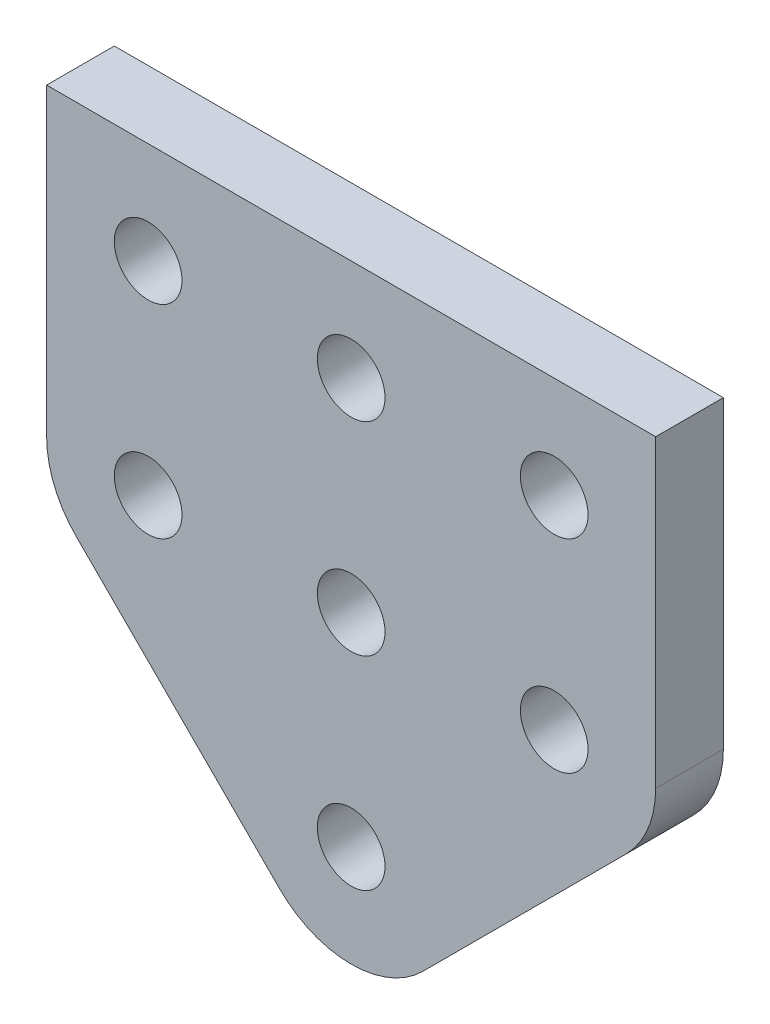
ISO-10303-21;
HEADER;
FILE_DESCRIPTION(('STEP AP214'),'2;1');
FILE_NAME('part.step','',(''),(''),'','','');
FILE_SCHEMA(('AUTOMOTIVE_DESIGN { 1 0 10303 214 1 1 1 1 }'));
ENDSEC;
DATA;
#1=APPLICATION_CONTEXT('core data for automotive mechanical design processes');
#2=APPLICATION_PROTOCOL_DEFINITION('international standard','automotive_design',2000,#1);
#3=PRODUCT_CONTEXT('',#1,'mechanical');
#4=PRODUCT('Part','Part','',(#3));
#5=PRODUCT_RELATED_PRODUCT_CATEGORY('part','',(#4));
#6=PRODUCT_DEFINITION_FORMATION('','',#4);
#7=PRODUCT_DEFINITION_CONTEXT('part definition',#1,'design');
#8=PRODUCT_DEFINITION('design','',#6,#7);
#9=PRODUCT_DEFINITION_SHAPE('','',#8);
#10=(LENGTH_UNIT() NAMED_UNIT(*) SI_UNIT(.MILLI.,.METRE.));
#11=(NAMED_UNIT(*) PLANE_ANGLE_UNIT() SI_UNIT($,.RADIAN.));
#12=(NAMED_UNIT(*) SI_UNIT($,.STERADIAN.) SOLID_ANGLE_UNIT());
#13=UNCERTAINTY_MEASURE_WITH_UNIT(LENGTH_MEASURE(1.E-05),#10,'distance_accuracy_value','');
#14=(GEOMETRIC_REPRESENTATION_CONTEXT(3) GLOBAL_UNCERTAINTY_ASSIGNED_CONTEXT((#13)) GLOBAL_UNIT_ASSIGNED_CONTEXT((#10,
#11,#12)) REPRESENTATION_CONTEXT('',''));
#15=CARTESIAN_POINT('',(0.,0.,0.));
#16=DIRECTION('',(0.,0.,1.));
#17=DIRECTION('',(1.,0.,0.));
#18=AXIS2_PLACEMENT_3D('',#15,#16,#17);
#19=CARTESIAN_POINT('',(187.7270545748,195.1787200631,3.));
#20=DIRECTION('',(0.,0.,1.));
#21=DIRECTION('',(1.,0.,0.));
#22=AXIS2_PLACEMENT_3D('',#19,#20,#21);
#23=PLANE('',#22);
#24=CARTESIAN_POINT('',(187.7270545748,195.1787200631,3.));
#25=DIRECTION('',(0.,0.,1.));
#26=DIRECTION('',(1.,0.,0.));
#27=AXIS2_PLACEMENT_3D('',#24,#25,#26);
#28=CIRCLE('',#27,1.5);
#29=CARTESIAN_POINT('',(189.2270545748,195.1787200631,3.));
#30=VERTEX_POINT('',#29);
#31=EDGE_CURVE('E206',#30,#30,#28,.T.);
#32=ORIENTED_EDGE('',*,*,#31,.F.);
#33=EDGE_LOOP('',(#32));
#34=FACE_BOUND('',#33,.T.);
#35=CARTESIAN_POINT('',(178.7270545748,213.1787200631,3.));
#36=DIRECTION('',(0.,0.,1.));
#37=DIRECTION('',(1.,0.,0.));
#38=AXIS2_PLACEMENT_3D('',#35,#36,#37);
#39=CIRCLE('',#38,1.5);
#40=CARTESIAN_POINT('',(180.2270545748,213.1787200631,3.));
#41=VERTEX_POINT('',#40);
#42=EDGE_CURVE('E194',#41,#41,#39,.T.);
#43=ORIENTED_EDGE('',*,*,#42,.F.);
#44=EDGE_LOOP('',(#43));
#45=FACE_BOUND('',#44,.T.);
#46=CARTESIAN_POINT('',(178.7270545748,204.1787200631,3.));
#47=DIRECTION('',(0.,0.,1.));
#48=DIRECTION('',(1.,0.,0.));
#49=AXIS2_PLACEMENT_3D('',#46,#47,#48);
#50=CIRCLE('',#49,1.5);
#51=CARTESIAN_POINT('',(180.2270545748,204.1787200631,3.));
#52=VERTEX_POINT('',#51);
#53=EDGE_CURVE('E182',#52,#52,#50,.T.);
#54=ORIENTED_EDGE('',*,*,#53,.F.);
#55=EDGE_LOOP('',(#54));
#56=FACE_BOUND('',#55,.T.);
#57=CARTESIAN_POINT('',(187.7270545748,195.1787200631,3.));
#58=DIRECTION('',(0.,0.,1.));
#59=DIRECTION('',(1.,0.,0.));
#60=AXIS2_PLACEMENT_3D('',#57,#58,#59);
#61=CIRCLE('',#60,4.50000000005025);
#62=CARTESIAN_POINT('',(184.5450740594,191.9967395477,3.));
#63=VERTEX_POINT('',#62);
#64=CARTESIAN_POINT('',(190.9090350901,191.9967395477,3.));
#65=VERTEX_POINT('',#64);
#66=EDGE_CURVE('E145',#63,#65,#61,.T.);
#67=ORIENTED_EDGE('',*,*,#66,.T.);
#68=DIRECTION('',(0.707106781186548,0.707106781186548,0.));
#69=VECTOR('',#68,1.);
#70=CARTESIAN_POINT('',(190.9090350901,191.9967395477,3.));
#71=LINE('',#70,#69);
#72=CARTESIAN_POINT('',(199.909035090095,200.996739547705,3.));
#73=VERTEX_POINT('',#72);
#74=EDGE_CURVE('E93',#65,#73,#71,.T.);
#75=ORIENTED_EDGE('',*,*,#74,.T.);
#76=CARTESIAN_POINT('',(196.7270545748,204.1787200631,3.));
#77=DIRECTION('',(0.,0.,1.));
#78=DIRECTION('',(1.,0.,0.));
#79=AXIS2_PLACEMENT_3D('',#76,#77,#78);
#80=CIRCLE('',#79,4.50000000000745);
#81=CARTESIAN_POINT('',(201.2270545748,204.1787200631,3.));
#82=VERTEX_POINT('',#81);
#83=EDGE_CURVE('E160',#73,#82,#80,.T.);
#84=ORIENTED_EDGE('',*,*,#83,.T.);
#85=DIRECTION('',(0.,1.,0.));
#86=VECTOR('',#85,1.);
#87=CARTESIAN_POINT('',(201.2270545748,217.6787200631,3.));
#88=LINE('',#87,#86);
#89=CARTESIAN_POINT('',(201.2270545748,217.6787200631,3.));
#90=VERTEX_POINT('',#89);
#91=EDGE_CURVE('E173',#82,#90,#88,.T.);
#92=ORIENTED_EDGE('',*,*,#91,.T.);
#93=DIRECTION('',(-1.,0.,0.));
#94=VECTOR('',#93,1.);
#95=CARTESIAN_POINT('',(201.2270545748,217.6787200631,3.));
#96=LINE('',#95,#94);
#97=CARTESIAN_POINT('',(174.2270545748,217.6787200631,3.));
#98=VERTEX_POINT('',#97);
#99=EDGE_CURVE('E112',#90,#98,#96,.T.);
#100=ORIENTED_EDGE('',*,*,#99,.T.);
#101=DIRECTION('',(0.,-1.,0.));
#102=VECTOR('',#101,1.);
#103=CARTESIAN_POINT('',(174.2270545748,213.1787200631,3.));
#104=LINE('',#103,#102);
#105=CARTESIAN_POINT('',(174.227054574757,204.1787200631,3.));
#106=VERTEX_POINT('',#105);
#107=EDGE_CURVE('E106',#98,#106,#104,.T.);
#108=ORIENTED_EDGE('',*,*,#107,.T.);
#109=CARTESIAN_POINT('',(178.7270545748,204.1787200631,3.));
#110=DIRECTION('',(0.,0.,1.));
#111=DIRECTION('',(1.,0.,0.));
#112=AXIS2_PLACEMENT_3D('',#109,#110,#111);
#113=CIRCLE('',#112,4.50000000004281);
#114=CARTESIAN_POINT('',(175.5450740594,200.9967395477,3.));
#115=VERTEX_POINT('',#114);
#116=EDGE_CURVE('E110',#106,#115,#113,.T.);
#117=ORIENTED_EDGE('',*,*,#116,.T.);
#118=DIRECTION('',(0.707106781186548,-0.707106781186548,0.));
#119=VECTOR('',#118,1.);
#120=CARTESIAN_POINT('',(184.5450740594,191.9967395477,3.));
#121=LINE('',#120,#119);
#122=EDGE_CURVE('E50',#115,#63,#121,.T.);
#123=ORIENTED_EDGE('',*,*,#122,.T.);
#124=EDGE_LOOP('',(#67,#75,#84,#92,#100,#108,#117,#123));
#125=FACE_BOUND('',#124,.T.);
#126=CARTESIAN_POINT('',(187.7270545748,204.1787200631,3.));
#127=DIRECTION('',(0.,0.,1.));
#128=DIRECTION('',(1.,0.,0.));
#129=AXIS2_PLACEMENT_3D('',#126,#127,#128);
#130=CIRCLE('',#129,1.5);
#131=CARTESIAN_POINT('',(189.2270545748,204.1787200631,3.));
#132=VERTEX_POINT('',#131);
#133=EDGE_CURVE('E133',#132,#132,#130,.T.);
#134=ORIENTED_EDGE('',*,*,#133,.F.);
#135=EDGE_LOOP('',(#134));
#136=FACE_BOUND('',#135,.T.);
#137=CARTESIAN_POINT('',(187.7270545748,213.1787200631,3.));
#138=DIRECTION('',(0.,0.,1.));
#139=DIRECTION('',(1.,0.,0.));
#140=AXIS2_PLACEMENT_3D('',#137,#138,#139);
#141=CIRCLE('',#140,1.5);
#142=CARTESIAN_POINT('',(189.2270545748,213.1787200631,3.));
#143=VERTEX_POINT('',#142);
#144=EDGE_CURVE('E188',#143,#143,#141,.T.);
#145=ORIENTED_EDGE('',*,*,#144,.F.);
#146=EDGE_LOOP('',(#145));
#147=FACE_BOUND('',#146,.T.);
#148=CARTESIAN_POINT('',(196.7270545748,213.1787200631,3.));
#149=DIRECTION('',(0.,0.,1.));
#150=DIRECTION('',(1.,0.,0.));
#151=AXIS2_PLACEMENT_3D('',#148,#149,#150);
#152=CIRCLE('',#151,1.5);
#153=CARTESIAN_POINT('',(198.2270545748,213.1787200631,3.));
#154=VERTEX_POINT('',#153);
#155=EDGE_CURVE('E200',#154,#154,#152,.T.);
#156=ORIENTED_EDGE('',*,*,#155,.F.);
#157=EDGE_LOOP('',(#156));
#158=FACE_BOUND('',#157,.T.);
#159=CARTESIAN_POINT('',(196.7270545748,204.1787200631,3.));
#160=DIRECTION('',(0.,0.,1.));
#161=DIRECTION('',(1.,0.,0.));
#162=AXIS2_PLACEMENT_3D('',#159,#160,#161);
#163=CIRCLE('',#162,1.5);
#164=CARTESIAN_POINT('',(198.2270545748,204.1787200631,3.));
#165=VERTEX_POINT('',#164);
#166=EDGE_CURVE('E212',#165,#165,#163,.T.);
#167=ORIENTED_EDGE('',*,*,#166,.F.);
#168=EDGE_LOOP('',(#167));
#169=FACE_BOUND('',#168,.T.);
#170=ADVANCED_FACE('F33',(#34,#45,#56,#125,#136,#147,#158,#169),#23,.T.);
#171=CARTESIAN_POINT('',(187.7270545748,195.1787200631,0.));
#172=DIRECTION('',(0.,0.,1.));
#173=DIRECTION('',(1.,0.,0.));
#174=AXIS2_PLACEMENT_3D('',#171,#172,#173);
#175=PLANE('',#174);
#176=CARTESIAN_POINT('',(187.7270545748,195.1787200631,0.));
#177=DIRECTION('',(0.,0.,1.));
#178=DIRECTION('',(1.,0.,0.));
#179=AXIS2_PLACEMENT_3D('',#176,#177,#178);
#180=CIRCLE('',#179,1.5);
#181=CARTESIAN_POINT('',(189.2270545748,195.1787200631,0.));
#182=VERTEX_POINT('',#181);
#183=EDGE_CURVE('E209',#182,#182,#180,.T.);
#184=ORIENTED_EDGE('',*,*,#183,.T.);
#185=EDGE_LOOP('',(#184));
#186=FACE_BOUND('',#185,.T.);
#187=CARTESIAN_POINT('',(178.7270545748,213.1787200631,0.));
#188=DIRECTION('',(0.,0.,1.));
#189=DIRECTION('',(1.,0.,0.));
#190=AXIS2_PLACEMENT_3D('',#187,#188,#189);
#191=CIRCLE('',#190,1.5);
#192=CARTESIAN_POINT('',(180.2270545748,213.1787200631,0.));
#193=VERTEX_POINT('',#192);
#194=EDGE_CURVE('E197',#193,#193,#191,.T.);
#195=ORIENTED_EDGE('',*,*,#194,.T.);
#196=EDGE_LOOP('',(#195));
#197=FACE_BOUND('',#196,.T.);
#198=CARTESIAN_POINT('',(178.7270545748,204.1787200631,0.));
#199=DIRECTION('',(0.,0.,1.));
#200=DIRECTION('',(1.,0.,0.));
#201=AXIS2_PLACEMENT_3D('',#198,#199,#200);
#202=CIRCLE('',#201,1.5);
#203=CARTESIAN_POINT('',(180.2270545748,204.1787200631,0.));
#204=VERTEX_POINT('',#203);
#205=EDGE_CURVE('E185',#204,#204,#202,.T.);
#206=ORIENTED_EDGE('',*,*,#205,.T.);
#207=EDGE_LOOP('',(#206));
#208=FACE_BOUND('',#207,.T.);
#209=CARTESIAN_POINT('',(187.7270545748,195.1787200631,0.));
#210=DIRECTION('',(0.,0.,1.));
#211=DIRECTION('',(1.,0.,0.));
#212=AXIS2_PLACEMENT_3D('',#209,#210,#211);
#213=CIRCLE('',#212,4.50000000005025);
#214=CARTESIAN_POINT('',(184.5450740594,191.9967395477,0.));
#215=VERTEX_POINT('',#214);
#216=CARTESIAN_POINT('',(190.9090350901,191.9967395477,0.));
#217=VERTEX_POINT('',#216);
#218=EDGE_CURVE('E129',#215,#217,#213,.T.);
#219=ORIENTED_EDGE('',*,*,#218,.F.);
#220=DIRECTION('',(0.707106781186548,-0.707106781186548,0.));
#221=VECTOR('',#220,1.);
#222=CARTESIAN_POINT('',(184.5450740594,191.9967395477,0.));
#223=LINE('',#222,#221);
#224=CARTESIAN_POINT('',(175.5450740594,200.9967395477,0.));
#225=VERTEX_POINT('',#224);
#226=EDGE_CURVE('E85',#225,#215,#223,.T.);
#227=ORIENTED_EDGE('',*,*,#226,.F.);
#228=CARTESIAN_POINT('',(178.7270545748,204.1787200631,0.));
#229=DIRECTION('',(0.,0.,1.));
#230=DIRECTION('',(1.,0.,0.));
#231=AXIS2_PLACEMENT_3D('',#228,#229,#230);
#232=CIRCLE('',#231,4.50000000004281);
#233=CARTESIAN_POINT('',(174.227054574757,204.1787200631,0.));
#234=VERTEX_POINT('',#233);
#235=EDGE_CURVE('E79',#234,#225,#232,.T.);
#236=ORIENTED_EDGE('',*,*,#235,.F.);
#237=DIRECTION('',(0.,-1.,0.));
#238=VECTOR('',#237,1.);
#239=CARTESIAN_POINT('',(174.2270545748,213.1787200631,0.));
#240=LINE('',#239,#238);
#241=CARTESIAN_POINT('',(174.2270545748,217.6787200631,0.));
#242=VERTEX_POINT('',#241);
#243=EDGE_CURVE('E119',#242,#234,#240,.T.);
#244=ORIENTED_EDGE('',*,*,#243,.F.);
#245=DIRECTION('',(-1.,0.,0.));
#246=VECTOR('',#245,1.);
#247=CARTESIAN_POINT('',(201.2270545748,217.6787200631,0.));
#248=LINE('',#247,#246);
#249=CARTESIAN_POINT('',(201.2270545748,217.6787200631,0.));
#250=VERTEX_POINT('',#249);
#251=EDGE_CURVE('E139',#250,#242,#248,.T.);
#252=ORIENTED_EDGE('',*,*,#251,.F.);
#253=DIRECTION('',(0.,1.,0.));
#254=VECTOR('',#253,1.);
#255=CARTESIAN_POINT('',(201.2270545748,217.6787200631,0.));
#256=LINE('',#255,#254);
#257=CARTESIAN_POINT('',(201.2270545748,204.1787200631,0.));
#258=VERTEX_POINT('',#257);
#259=EDGE_CURVE('E137',#258,#250,#256,.T.);
#260=ORIENTED_EDGE('',*,*,#259,.F.);
#261=CARTESIAN_POINT('',(196.7270545748,204.1787200631,0.));
#262=DIRECTION('',(0.,0.,1.));
#263=DIRECTION('',(1.,0.,0.));
#264=AXIS2_PLACEMENT_3D('',#261,#262,#263);
#265=CIRCLE('',#264,4.50000000000745);
#266=CARTESIAN_POINT('',(199.909035090095,200.996739547705,0.));
#267=VERTEX_POINT('',#266);
#268=EDGE_CURVE('E135',#267,#258,#265,.T.);
#269=ORIENTED_EDGE('',*,*,#268,.F.);
#270=DIRECTION('',(0.707106781186548,0.707106781186548,0.));
#271=VECTOR('',#270,1.);
#272=CARTESIAN_POINT('',(190.9090350901,191.9967395477,0.));
#273=LINE('',#272,#271);
#274=EDGE_CURVE('E132',#217,#267,#273,.T.);
#275=ORIENTED_EDGE('',*,*,#274,.F.);
#276=EDGE_LOOP('',(#219,#227,#236,#244,#252,#260,#269,#275));
#277=FACE_BOUND('',#276,.T.);
#278=CARTESIAN_POINT('',(187.7270545748,204.1787200631,0.));
#279=DIRECTION('',(0.,0.,1.));
#280=DIRECTION('',(1.,0.,0.));
#281=AXIS2_PLACEMENT_3D('',#278,#279,#280);
#282=CIRCLE('',#281,1.5);
#283=CARTESIAN_POINT('',(189.2270545748,204.1787200631,0.));
#284=VERTEX_POINT('',#283);
#285=EDGE_CURVE('E179',#284,#284,#282,.T.);
#286=ORIENTED_EDGE('',*,*,#285,.T.);
#287=EDGE_LOOP('',(#286));
#288=FACE_BOUND('',#287,.T.);
#289=CARTESIAN_POINT('',(187.7270545748,213.1787200631,0.));
#290=DIRECTION('',(0.,0.,1.));
#291=DIRECTION('',(1.,0.,0.));
#292=AXIS2_PLACEMENT_3D('',#289,#290,#291);
#293=CIRCLE('',#292,1.5);
#294=CARTESIAN_POINT('',(189.2270545748,213.1787200631,0.));
#295=VERTEX_POINT('',#294);
#296=EDGE_CURVE('E191',#295,#295,#293,.T.);
#297=ORIENTED_EDGE('',*,*,#296,.T.);
#298=EDGE_LOOP('',(#297));
#299=FACE_BOUND('',#298,.T.);
#300=CARTESIAN_POINT('',(196.7270545748,213.1787200631,0.));
#301=DIRECTION('',(0.,0.,1.));
#302=DIRECTION('',(1.,0.,0.));
#303=AXIS2_PLACEMENT_3D('',#300,#301,#302);
#304=CIRCLE('',#303,1.5);
#305=CARTESIAN_POINT('',(198.2270545748,213.1787200631,0.));
#306=VERTEX_POINT('',#305);
#307=EDGE_CURVE('E203',#306,#306,#304,.T.);
#308=ORIENTED_EDGE('',*,*,#307,.T.);
#309=EDGE_LOOP('',(#308));
#310=FACE_BOUND('',#309,.T.);
#311=CARTESIAN_POINT('',(196.7270545748,204.1787200631,0.));
#312=DIRECTION('',(0.,0.,1.));
#313=DIRECTION('',(1.,0.,0.));
#314=AXIS2_PLACEMENT_3D('',#311,#312,#313);
#315=CIRCLE('',#314,1.5);
#316=CARTESIAN_POINT('',(198.2270545748,204.1787200631,0.));
#317=VERTEX_POINT('',#316);
#318=EDGE_CURVE('E215',#317,#317,#315,.T.);
#319=ORIENTED_EDGE('',*,*,#318,.T.);
#320=EDGE_LOOP('',(#319));
#321=FACE_BOUND('',#320,.T.);
#322=ADVANCED_FACE('F164',(#186,#197,#208,#277,#288,#299,#310,#321),#175,.F.);
#323=CARTESIAN_POINT('',(187.7270545748,195.1787200631,3.));
#324=DIRECTION('',(0.,0.,-1.));
#325=DIRECTION('',(-1.,0.,0.));
#326=AXIS2_PLACEMENT_3D('',#323,#324,#325);
#327=CYLINDRICAL_SURFACE('',#326,4.50000000005025);
#328=ORIENTED_EDGE('',*,*,#218,.T.);
#329=DIRECTION('',(0.,0.,-1.));
#330=VECTOR('',#329,1.);
#331=CARTESIAN_POINT('',(190.9090350901,191.9967395477,3.));
#332=LINE('',#331,#330);
#333=EDGE_CURVE('E11',#65,#217,#332,.T.);
#334=ORIENTED_EDGE('',*,*,#333,.F.);
#335=ORIENTED_EDGE('',*,*,#66,.F.);
#336=DIRECTION('',(0.,0.,-1.));
#337=VECTOR('',#336,1.);
#338=CARTESIAN_POINT('',(184.5450740594,191.9967395477,3.));
#339=LINE('',#338,#337);
#340=EDGE_CURVE('E125',#63,#215,#339,.T.);
#341=ORIENTED_EDGE('',*,*,#340,.T.);
#342=EDGE_LOOP('',(#328,#334,#335,#341));
#343=FACE_BOUND('',#342,.T.);
#344=ADVANCED_FACE('F35',(#343),#327,.T.);
#345=CARTESIAN_POINT('',(190.9090350901,191.9967395477,3.));
#346=DIRECTION('',(-0.707106781186547,0.707106781186547,0.));
#347=DIRECTION('',(-0.707106781186548,-0.707106781186548,0.));
#348=AXIS2_PLACEMENT_3D('',#345,#346,#347);
#349=PLANE('',#348);
#350=ORIENTED_EDGE('',*,*,#274,.T.);
#351=DIRECTION('',(0.,0.,-1.));
#352=VECTOR('',#351,1.);
#353=CARTESIAN_POINT('',(199.909035090095,200.996739547705,3.));
#354=LINE('',#353,#352);
#355=EDGE_CURVE('E42',#73,#267,#354,.T.);
#356=ORIENTED_EDGE('',*,*,#355,.F.);
#357=ORIENTED_EDGE('',*,*,#74,.F.);
#358=ORIENTED_EDGE('',*,*,#333,.T.);
#359=EDGE_LOOP('',(#350,#356,#357,#358));
#360=FACE_BOUND('',#359,.T.);
#361=ADVANCED_FACE('F250',(#360),#349,.F.);
#362=CARTESIAN_POINT('',(196.7270545748,204.1787200631,3.));
#363=DIRECTION('',(0.,0.,-1.));
#364=DIRECTION('',(-1.,0.,0.));
#365=AXIS2_PLACEMENT_3D('',#362,#363,#364);
#366=CYLINDRICAL_SURFACE('',#365,4.50000000000745);
#367=ORIENTED_EDGE('',*,*,#268,.T.);
#368=DIRECTION('',(0.,0.,-1.));
#369=VECTOR('',#368,1.);
#370=CARTESIAN_POINT('',(201.2270545748,204.1787200631,3.));
#371=LINE('',#370,#369);
#372=EDGE_CURVE('E152',#82,#258,#371,.T.);
#373=ORIENTED_EDGE('',*,*,#372,.F.);
#374=ORIENTED_EDGE('',*,*,#83,.F.);
#375=ORIENTED_EDGE('',*,*,#355,.T.);
#376=EDGE_LOOP('',(#367,#373,#374,#375));
#377=FACE_BOUND('',#376,.T.);
#378=ADVANCED_FACE('F158',(#377),#366,.T.);
#379=CARTESIAN_POINT('',(201.2270545748,217.6787200631,3.));
#380=DIRECTION('',(-1.,0.,0.));
#381=DIRECTION('',(0.,0.,1.));
#382=AXIS2_PLACEMENT_3D('',#379,#380,#381);
#383=PLANE('',#382);
#384=ORIENTED_EDGE('',*,*,#259,.T.);
#385=DIRECTION('',(0.,0.,-1.));
#386=VECTOR('',#385,1.);
#387=CARTESIAN_POINT('',(201.2270545748,217.6787200631,3.));
#388=LINE('',#387,#386);
#389=EDGE_CURVE('E149',#90,#250,#388,.T.);
#390=ORIENTED_EDGE('',*,*,#389,.F.);
#391=ORIENTED_EDGE('',*,*,#91,.F.);
#392=ORIENTED_EDGE('',*,*,#372,.T.);
#393=EDGE_LOOP('',(#384,#390,#391,#392));
#394=FACE_BOUND('',#393,.T.);
#395=ADVANCED_FACE('F169',(#394),#383,.F.);
#396=CARTESIAN_POINT('',(201.2270545748,217.6787200631,3.));
#397=DIRECTION('',(0.,-1.,0.));
#398=DIRECTION('',(0.,0.,-1.));
#399=AXIS2_PLACEMENT_3D('',#396,#397,#398);
#400=PLANE('',#399);
#401=ORIENTED_EDGE('',*,*,#251,.T.);
#402=DIRECTION('',(0.,0.,-1.));
#403=VECTOR('',#402,1.);
#404=CARTESIAN_POINT('',(174.2270545748,217.6787200631,3.));
#405=LINE('',#404,#403);
#406=EDGE_CURVE('E120',#98,#242,#405,.T.);
#407=ORIENTED_EDGE('',*,*,#406,.F.);
#408=ORIENTED_EDGE('',*,*,#99,.F.);
#409=ORIENTED_EDGE('',*,*,#389,.T.);
#410=EDGE_LOOP('',(#401,#407,#408,#409));
#411=FACE_BOUND('',#410,.T.);
#412=ADVANCED_FACE('F172',(#411),#400,.F.);
#413=CARTESIAN_POINT('',(174.2270545748,213.1787200631,3.));
#414=DIRECTION('',(1.,0.,0.));
#415=DIRECTION('',(0.,0.,-1.));
#416=AXIS2_PLACEMENT_3D('',#413,#414,#415);
#417=PLANE('',#416);
#418=ORIENTED_EDGE('',*,*,#243,.T.);
#419=DIRECTION('',(0.,0.,-1.));
#420=VECTOR('',#419,1.);
#421=CARTESIAN_POINT('',(174.227054574757,204.1787200631,3.));
#422=LINE('',#421,#420);
#423=EDGE_CURVE('E117',#106,#234,#422,.T.);
#424=ORIENTED_EDGE('',*,*,#423,.F.);
#425=ORIENTED_EDGE('',*,*,#107,.F.);
#426=ORIENTED_EDGE('',*,*,#406,.T.);
#427=EDGE_LOOP('',(#418,#424,#425,#426));
#428=FACE_BOUND('',#427,.T.);
#429=ADVANCED_FACE('F118',(#428),#417,.F.);
#430=CARTESIAN_POINT('',(178.7270545748,204.1787200631,3.));
#431=DIRECTION('',(0.,0.,-1.));
#432=DIRECTION('',(-1.,0.,0.));
#433=AXIS2_PLACEMENT_3D('',#430,#431,#432);
#434=CYLINDRICAL_SURFACE('',#433,4.50000000004281);
#435=ORIENTED_EDGE('',*,*,#235,.T.);
#436=DIRECTION('',(0.,0.,-1.));
#437=VECTOR('',#436,1.);
#438=CARTESIAN_POINT('',(175.5450740594,200.9967395477,3.));
#439=LINE('',#438,#437);
#440=EDGE_CURVE('E121',#115,#225,#439,.T.);
#441=ORIENTED_EDGE('',*,*,#440,.F.);
#442=ORIENTED_EDGE('',*,*,#116,.F.);
#443=ORIENTED_EDGE('',*,*,#423,.T.);
#444=EDGE_LOOP('',(#435,#441,#442,#443));
#445=FACE_BOUND('',#444,.T.);
#446=ADVANCED_FACE('F123',(#445),#434,.T.);
#447=CARTESIAN_POINT('',(184.5450740594,191.9967395477,3.));
#448=DIRECTION('',(0.707106781186547,0.707106781186547,0.));
#449=DIRECTION('',(-0.707106781186548,0.707106781186548,0.));
#450=AXIS2_PLACEMENT_3D('',#447,#448,#449);
#451=PLANE('',#450);
#452=ORIENTED_EDGE('',*,*,#226,.T.);
#453=ORIENTED_EDGE('',*,*,#340,.F.);
#454=ORIENTED_EDGE('',*,*,#122,.F.);
#455=ORIENTED_EDGE('',*,*,#440,.T.);
#456=EDGE_LOOP('',(#452,#453,#454,#455));
#457=FACE_BOUND('',#456,.T.);
#458=ADVANCED_FACE('F238',(#457),#451,.F.);
#459=CARTESIAN_POINT('',(187.7270545748,204.1787200631,3.));
#460=DIRECTION('',(0.,0.,-1.));
#461=DIRECTION('',(-1.,0.,0.));
#462=AXIS2_PLACEMENT_3D('',#459,#460,#461);
#463=CYLINDRICAL_SURFACE('',#462,1.5);
#464=ORIENTED_EDGE('',*,*,#133,.T.);
#465=EDGE_LOOP('',(#464));
#466=FACE_BOUND('',#465,.T.);
#467=ORIENTED_EDGE('',*,*,#285,.F.);
#468=EDGE_LOOP('',(#467));
#469=FACE_BOUND('',#468,.T.);
#470=ADVANCED_FACE('F235',(#466,#469),#463,.F.);
#471=CARTESIAN_POINT('',(178.7270545748,204.1787200631,3.));
#472=DIRECTION('',(0.,0.,-1.));
#473=DIRECTION('',(-1.,0.,0.));
#474=AXIS2_PLACEMENT_3D('',#471,#472,#473);
#475=CYLINDRICAL_SURFACE('',#474,1.5);
#476=ORIENTED_EDGE('',*,*,#53,.T.);
#477=EDGE_LOOP('',(#476));
#478=FACE_BOUND('',#477,.T.);
#479=ORIENTED_EDGE('',*,*,#205,.F.);
#480=EDGE_LOOP('',(#479));
#481=FACE_BOUND('',#480,.T.);
#482=ADVANCED_FACE('F317',(#478,#481),#475,.F.);
#483=CARTESIAN_POINT('',(187.7270545748,213.1787200631,3.));
#484=DIRECTION('',(0.,0.,-1.));
#485=DIRECTION('',(-1.,0.,0.));
#486=AXIS2_PLACEMENT_3D('',#483,#484,#485);
#487=CYLINDRICAL_SURFACE('',#486,1.5);
#488=ORIENTED_EDGE('',*,*,#144,.T.);
#489=EDGE_LOOP('',(#488));
#490=FACE_BOUND('',#489,.T.);
#491=ORIENTED_EDGE('',*,*,#296,.F.);
#492=EDGE_LOOP('',(#491));
#493=FACE_BOUND('',#492,.T.);
#494=ADVANCED_FACE('F325',(#490,#493),#487,.F.);
#495=CARTESIAN_POINT('',(178.7270545748,213.1787200631,3.));
#496=DIRECTION('',(0.,0.,-1.));
#497=DIRECTION('',(-1.,0.,0.));
#498=AXIS2_PLACEMENT_3D('',#495,#496,#497);
#499=CYLINDRICAL_SURFACE('',#498,1.5);
#500=ORIENTED_EDGE('',*,*,#42,.T.);
#501=EDGE_LOOP('',(#500));
#502=FACE_BOUND('',#501,.T.);
#503=ORIENTED_EDGE('',*,*,#194,.F.);
#504=EDGE_LOOP('',(#503));
#505=FACE_BOUND('',#504,.T.);
#506=ADVANCED_FACE('F333',(#502,#505),#499,.F.);
#507=CARTESIAN_POINT('',(196.7270545748,213.1787200631,3.));
#508=DIRECTION('',(0.,0.,-1.));
#509=DIRECTION('',(-1.,0.,0.));
#510=AXIS2_PLACEMENT_3D('',#507,#508,#509);
#511=CYLINDRICAL_SURFACE('',#510,1.5);
#512=ORIENTED_EDGE('',*,*,#155,.T.);
#513=EDGE_LOOP('',(#512));
#514=FACE_BOUND('',#513,.T.);
#515=ORIENTED_EDGE('',*,*,#307,.F.);
#516=EDGE_LOOP('',(#515));
#517=FACE_BOUND('',#516,.T.);
#518=ADVANCED_FACE('F342',(#514,#517),#511,.F.);
#519=CARTESIAN_POINT('',(187.7270545748,195.1787200631,3.));
#520=DIRECTION('',(0.,0.,-1.));
#521=DIRECTION('',(-1.,0.,0.));
#522=AXIS2_PLACEMENT_3D('',#519,#520,#521);
#523=CYLINDRICAL_SURFACE('',#522,1.5);
#524=ORIENTED_EDGE('',*,*,#31,.T.);
#525=EDGE_LOOP('',(#524));
#526=FACE_BOUND('',#525,.T.);
#527=ORIENTED_EDGE('',*,*,#183,.F.);
#528=EDGE_LOOP('',(#527));
#529=FACE_BOUND('',#528,.T.);
#530=ADVANCED_FACE('F351',(#526,#529),#523,.F.);
#531=CARTESIAN_POINT('',(196.7270545748,204.1787200631,3.));
#532=DIRECTION('',(0.,0.,-1.));
#533=DIRECTION('',(-1.,0.,0.));
#534=AXIS2_PLACEMENT_3D('',#531,#532,#533);
#535=CYLINDRICAL_SURFACE('',#534,1.5);
#536=ORIENTED_EDGE('',*,*,#166,.T.);
#537=EDGE_LOOP('',(#536));
#538=FACE_BOUND('',#537,.T.);
#539=ORIENTED_EDGE('',*,*,#318,.F.);
#540=EDGE_LOOP('',(#539));
#541=FACE_BOUND('',#540,.T.);
#542=ADVANCED_FACE('F221',(#538,#541),#535,.F.);
#543=CLOSED_SHELL('',(#170,#322,#344,#361,#378,#395,#412,#429,#446,#458,#470,#482,#494,#506,
#518,#530,#542));
#544=MANIFOLD_SOLID_BREP('B2',#543);
#545=ADVANCED_BREP_SHAPE_REPRESENTATION('',(#18,#544),#14);
#546=SHAPE_DEFINITION_REPRESENTATION(#9,#545);
ENDSEC;
END-ISO-10303-21;
